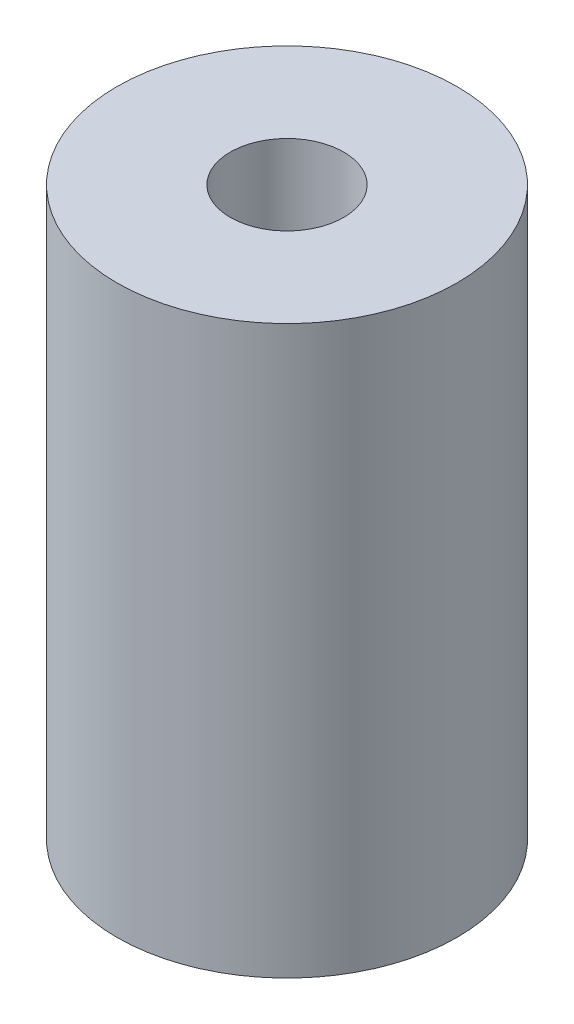
ISO-10303-21;
HEADER;
FILE_DESCRIPTION(('STEP AP214'),'2;1');
FILE_NAME('part.step','',(''),(''),'','','');
FILE_SCHEMA(('AUTOMOTIVE_DESIGN { 1 0 10303 214 1 1 1 1 }'));
ENDSEC;
DATA;
#1=APPLICATION_CONTEXT('core data for automotive mechanical design processes');
#2=APPLICATION_PROTOCOL_DEFINITION('international standard','automotive_design',2000,#1);
#3=PRODUCT_CONTEXT('',#1,'mechanical');
#4=PRODUCT('Part','Part','',(#3));
#5=PRODUCT_RELATED_PRODUCT_CATEGORY('part','',(#4));
#6=PRODUCT_DEFINITION_FORMATION('','',#4);
#7=PRODUCT_DEFINITION_CONTEXT('part definition',#1,'design');
#8=PRODUCT_DEFINITION('design','',#6,#7);
#9=PRODUCT_DEFINITION_SHAPE('','',#8);
#10=(LENGTH_UNIT() NAMED_UNIT(*) SI_UNIT(.MILLI.,.METRE.));
#11=(NAMED_UNIT(*) PLANE_ANGLE_UNIT() SI_UNIT($,.RADIAN.));
#12=(NAMED_UNIT(*) SI_UNIT($,.STERADIAN.) SOLID_ANGLE_UNIT());
#13=UNCERTAINTY_MEASURE_WITH_UNIT(LENGTH_MEASURE(1.E-05),#10,'distance_accuracy_value','');
#14=(GEOMETRIC_REPRESENTATION_CONTEXT(3) GLOBAL_UNCERTAINTY_ASSIGNED_CONTEXT((#13)) GLOBAL_UNIT_ASSIGNED_CONTEXT((#10,
#11,#12)) REPRESENTATION_CONTEXT('',''));
#15=CARTESIAN_POINT('',(0.,0.,0.));
#16=DIRECTION('',(0.,0.,1.));
#17=DIRECTION('',(1.,0.,0.));
#18=AXIS2_PLACEMENT_3D('',#15,#16,#17);
#19=CARTESIAN_POINT('',(0.,15.,0.));
#20=DIRECTION('',(0.,1.,0.));
#21=DIRECTION('',(0.,0.,1.));
#22=AXIS2_PLACEMENT_3D('',#19,#20,#21);
#23=PLANE('',#22);
#24=CARTESIAN_POINT('',(0.,15.,0.));
#25=DIRECTION('',(0.,1.,0.));
#26=DIRECTION('',(0.,0.,1.));
#27=AXIS2_PLACEMENT_3D('',#24,#25,#26);
#28=CIRCLE('',#27,4.5);
#29=CARTESIAN_POINT('',(0.,15.,4.5));
#30=VERTEX_POINT('',#29);
#31=EDGE_CURVE('E10',#30,#30,#28,.T.);
#32=ORIENTED_EDGE('',*,*,#31,.T.);
#33=EDGE_LOOP('',(#32));
#34=FACE_BOUND('',#33,.T.);
#35=CARTESIAN_POINT('',(0.,15.,0.));
#36=DIRECTION('',(0.,1.,0.));
#37=DIRECTION('',(0.,0.,1.));
#38=AXIS2_PLACEMENT_3D('',#35,#36,#37);
#39=CIRCLE('',#38,1.5);
#40=CARTESIAN_POINT('',(0.,15.,1.5));
#41=VERTEX_POINT('',#40);
#42=EDGE_CURVE('E46',#41,#41,#39,.T.);
#43=ORIENTED_EDGE('',*,*,#42,.F.);
#44=EDGE_LOOP('',(#43));
#45=FACE_BOUND('',#44,.T.);
#46=ADVANCED_FACE('F35',(#34,#45),#23,.T.);
#47=CARTESIAN_POINT('',(0.,0.,0.));
#48=DIRECTION('',(0.,1.,0.));
#49=DIRECTION('',(0.,0.,1.));
#50=AXIS2_PLACEMENT_3D('',#47,#48,#49);
#51=PLANE('',#50);
#52=CARTESIAN_POINT('',(0.,0.,0.));
#53=DIRECTION('',(0.,1.,0.));
#54=DIRECTION('',(0.,0.,1.));
#55=AXIS2_PLACEMENT_3D('',#52,#53,#54);
#56=CIRCLE('',#55,4.5);
#57=CARTESIAN_POINT('',(0.,0.,4.5));
#58=VERTEX_POINT('',#57);
#59=EDGE_CURVE('E39',#58,#58,#56,.T.);
#60=ORIENTED_EDGE('',*,*,#59,.F.);
#61=EDGE_LOOP('',(#60));
#62=FACE_BOUND('',#61,.T.);
#63=CARTESIAN_POINT('',(0.,0.,0.));
#64=DIRECTION('',(0.,1.,0.));
#65=DIRECTION('',(0.,0.,1.));
#66=AXIS2_PLACEMENT_3D('',#63,#64,#65);
#67=CIRCLE('',#66,1.5);
#68=CARTESIAN_POINT('',(0.,0.,1.5));
#69=VERTEX_POINT('',#68);
#70=EDGE_CURVE('E48',#69,#69,#67,.T.);
#71=ORIENTED_EDGE('',*,*,#70,.T.);
#72=EDGE_LOOP('',(#71));
#73=FACE_BOUND('',#72,.T.);
#74=ADVANCED_FACE('F58',(#62,#73),#51,.F.);
#75=CARTESIAN_POINT('',(0.,15.,0.));
#76=DIRECTION('',(0.,-1.,0.));
#77=DIRECTION('',(0.,0.,-1.));
#78=AXIS2_PLACEMENT_3D('',#75,#76,#77);
#79=CYLINDRICAL_SURFACE('',#78,4.5);
#80=ORIENTED_EDGE('',*,*,#31,.F.);
#81=EDGE_LOOP('',(#80));
#82=FACE_BOUND('',#81,.T.);
#83=ORIENTED_EDGE('',*,*,#59,.T.);
#84=EDGE_LOOP('',(#83));
#85=FACE_BOUND('',#84,.T.);
#86=ADVANCED_FACE('F37',(#82,#85),#79,.T.);
#87=CARTESIAN_POINT('',(0.,15.,0.));
#88=DIRECTION('',(0.,-1.,0.));
#89=DIRECTION('',(0.,0.,-1.));
#90=AXIS2_PLACEMENT_3D('',#87,#88,#89);
#91=CYLINDRICAL_SURFACE('',#90,1.5);
#92=ORIENTED_EDGE('',*,*,#42,.T.);
#93=EDGE_LOOP('',(#92));
#94=FACE_BOUND('',#93,.T.);
#95=ORIENTED_EDGE('',*,*,#70,.F.);
#96=EDGE_LOOP('',(#95));
#97=FACE_BOUND('',#96,.T.);
#98=ADVANCED_FACE('F54',(#94,#97),#91,.F.);
#99=CLOSED_SHELL('',(#46,#74,#86,#98));
#100=MANIFOLD_SOLID_BREP('B2',#99);
#101=ADVANCED_BREP_SHAPE_REPRESENTATION('',(#18,#100),#14);
#102=SHAPE_DEFINITION_REPRESENTATION(#9,#101);
ENDSEC;
END-ISO-10303-21;
